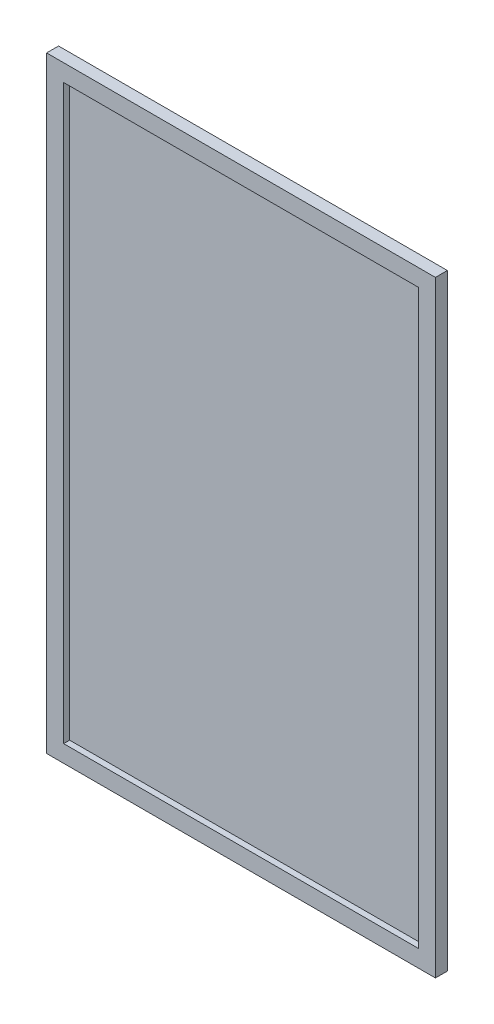
ISO-10303-21;
HEADER;
FILE_DESCRIPTION(('STEP AP214'),'2;1');
FILE_NAME('part.step','',(''),(''),'','','');
FILE_SCHEMA(('AUTOMOTIVE_DESIGN { 1 0 10303 214 1 1 1 1 }'));
ENDSEC;
DATA;
#1=APPLICATION_CONTEXT('core data for automotive mechanical design processes');
#2=APPLICATION_PROTOCOL_DEFINITION('international standard','automotive_design',2000,#1);
#3=PRODUCT_CONTEXT('',#1,'mechanical');
#4=PRODUCT('Part','Part','',(#3));
#5=PRODUCT_RELATED_PRODUCT_CATEGORY('part','',(#4));
#6=PRODUCT_DEFINITION_FORMATION('','',#4);
#7=PRODUCT_DEFINITION_CONTEXT('part definition',#1,'design');
#8=PRODUCT_DEFINITION('design','',#6,#7);
#9=PRODUCT_DEFINITION_SHAPE('','',#8);
#10=(LENGTH_UNIT() NAMED_UNIT(*) SI_UNIT(.MILLI.,.METRE.));
#11=(NAMED_UNIT(*) PLANE_ANGLE_UNIT() SI_UNIT($,.RADIAN.));
#12=(NAMED_UNIT(*) SI_UNIT($,.STERADIAN.) SOLID_ANGLE_UNIT());
#13=UNCERTAINTY_MEASURE_WITH_UNIT(LENGTH_MEASURE(1.E-05),#10,'distance_accuracy_value','');
#14=(GEOMETRIC_REPRESENTATION_CONTEXT(3) GLOBAL_UNCERTAINTY_ASSIGNED_CONTEXT((#13)) GLOBAL_UNIT_ASSIGNED_CONTEXT((#10,
#11,#12)) REPRESENTATION_CONTEXT('',''));
#15=CARTESIAN_POINT('',(0.,0.,0.));
#16=DIRECTION('',(0.,0.,1.));
#17=DIRECTION('',(1.,0.,0.));
#18=AXIS2_PLACEMENT_3D('',#15,#16,#17);
#19=CARTESIAN_POINT('',(0.,0.,71.12));
#20=DIRECTION('',(1.,0.,0.));
#21=DIRECTION('',(0.,0.,-1.));
#22=AXIS2_PLACEMENT_3D('',#19,#20,#21);
#23=PLANE('',#22);
#24=DIRECTION('',(0.,-1.,0.));
#25=VECTOR('',#24,1.);
#26=CARTESIAN_POINT('',(0.,0.,0.));
#27=LINE('',#26,#25);
#28=CARTESIAN_POINT('',(0.,3606.8,0.));
#29=VERTEX_POINT('',#28);
#30=CARTESIAN_POINT('',(0.,0.,0.));
#31=VERTEX_POINT('',#30);
#32=EDGE_CURVE('E160',#29,#31,#27,.T.);
#33=ORIENTED_EDGE('',*,*,#32,.T.);
#34=DIRECTION('',(0.,0.,-1.));
#35=VECTOR('',#34,1.);
#36=CARTESIAN_POINT('',(0.,0.,71.12));
#37=LINE('',#36,#35);
#38=CARTESIAN_POINT('',(0.,0.,71.12));
#39=VERTEX_POINT('',#38);
#40=EDGE_CURVE('E11',#39,#31,#37,.T.);
#41=ORIENTED_EDGE('',*,*,#40,.F.);
#42=DIRECTION('',(0.,-1.,0.));
#43=VECTOR('',#42,1.);
#44=CARTESIAN_POINT('',(0.,0.,71.12));
#45=LINE('',#44,#43);
#46=CARTESIAN_POINT('',(0.,3606.8,71.12));
#47=VERTEX_POINT('',#46);
#48=EDGE_CURVE('E166',#47,#39,#45,.T.);
#49=ORIENTED_EDGE('',*,*,#48,.F.);
#50=DIRECTION('',(0.,0.,-1.));
#51=VECTOR('',#50,1.);
#52=CARTESIAN_POINT('',(0.,3606.8,71.12));
#53=LINE('',#52,#51);
#54=EDGE_CURVE('E176',#47,#29,#53,.T.);
#55=ORIENTED_EDGE('',*,*,#54,.T.);
#56=EDGE_LOOP('',(#33,#41,#49,#55));
#57=FACE_BOUND('',#56,.T.);
#58=ADVANCED_FACE('F41',(#57),#23,.F.);
#59=CARTESIAN_POINT('',(0.,0.,71.12));
#60=DIRECTION('',(0.,1.,0.));
#61=DIRECTION('',(0.,0.,1.));
#62=AXIS2_PLACEMENT_3D('',#59,#60,#61);
#63=PLANE('',#62);
#64=DIRECTION('',(1.,0.,0.));
#65=VECTOR('',#64,1.);
#66=CARTESIAN_POINT('',(0.,0.,0.));
#67=LINE('',#66,#65);
#68=CARTESIAN_POINT('',(2311.4,0.,0.));
#69=VERTEX_POINT('',#68);
#70=EDGE_CURVE('E180',#31,#69,#67,.T.);
#71=ORIENTED_EDGE('',*,*,#70,.T.);
#72=DIRECTION('',(0.,0.,-1.));
#73=VECTOR('',#72,1.);
#74=CARTESIAN_POINT('',(2311.4,0.,71.12));
#75=LINE('',#74,#73);
#76=CARTESIAN_POINT('',(2311.4,0.,71.12));
#77=VERTEX_POINT('',#76);
#78=EDGE_CURVE('E49',#77,#69,#75,.T.);
#79=ORIENTED_EDGE('',*,*,#78,.F.);
#80=DIRECTION('',(1.,0.,0.));
#81=VECTOR('',#80,1.);
#82=CARTESIAN_POINT('',(0.,0.,71.12));
#83=LINE('',#82,#81);
#84=EDGE_CURVE('E93',#39,#77,#83,.T.);
#85=ORIENTED_EDGE('',*,*,#84,.F.);
#86=ORIENTED_EDGE('',*,*,#40,.T.);
#87=EDGE_LOOP('',(#71,#79,#85,#86));
#88=FACE_BOUND('',#87,.T.);
#89=ADVANCED_FACE('F215',(#88),#63,.F.);
#90=CARTESIAN_POINT('',(2311.4,0.,71.12));
#91=DIRECTION('',(-1.,0.,0.));
#92=DIRECTION('',(0.,0.,1.));
#93=AXIS2_PLACEMENT_3D('',#90,#91,#92);
#94=PLANE('',#93);
#95=DIRECTION('',(0.,1.,0.));
#96=VECTOR('',#95,1.);
#97=CARTESIAN_POINT('',(2311.4,0.,0.));
#98=LINE('',#97,#96);
#99=CARTESIAN_POINT('',(2311.4,3606.8,0.));
#100=VERTEX_POINT('',#99);
#101=EDGE_CURVE('E183',#69,#100,#98,.T.);
#102=ORIENTED_EDGE('',*,*,#101,.T.);
#103=DIRECTION('',(0.,0.,-1.));
#104=VECTOR('',#103,1.);
#105=CARTESIAN_POINT('',(2311.4,3606.8,71.12));
#106=LINE('',#105,#104);
#107=CARTESIAN_POINT('',(2311.4,3606.8,71.12));
#108=VERTEX_POINT('',#107);
#109=EDGE_CURVE('E190',#108,#100,#106,.T.);
#110=ORIENTED_EDGE('',*,*,#109,.F.);
#111=DIRECTION('',(0.,1.,0.));
#112=VECTOR('',#111,1.);
#113=CARTESIAN_POINT('',(2311.4,0.,71.12));
#114=LINE('',#113,#112);
#115=EDGE_CURVE('E171',#77,#108,#114,.T.);
#116=ORIENTED_EDGE('',*,*,#115,.F.);
#117=ORIENTED_EDGE('',*,*,#78,.T.);
#118=EDGE_LOOP('',(#102,#110,#116,#117));
#119=FACE_BOUND('',#118,.T.);
#120=ADVANCED_FACE('F197',(#119),#94,.F.);
#121=CARTESIAN_POINT('',(0.,3606.8,71.12));
#122=DIRECTION('',(0.,-1.,0.));
#123=DIRECTION('',(0.,0.,-1.));
#124=AXIS2_PLACEMENT_3D('',#121,#122,#123);
#125=PLANE('',#124);
#126=DIRECTION('',(-1.,0.,0.));
#127=VECTOR('',#126,1.);
#128=CARTESIAN_POINT('',(0.,3606.8,0.));
#129=LINE('',#128,#127);
#130=EDGE_CURVE('E86',#100,#29,#129,.T.);
#131=ORIENTED_EDGE('',*,*,#130,.T.);
#132=ORIENTED_EDGE('',*,*,#54,.F.);
#133=DIRECTION('',(-1.,0.,0.));
#134=VECTOR('',#133,1.);
#135=CARTESIAN_POINT('',(0.,3606.8,71.12));
#136=LINE('',#135,#134);
#137=EDGE_CURVE('E65',#108,#47,#136,.T.);
#138=ORIENTED_EDGE('',*,*,#137,.F.);
#139=ORIENTED_EDGE('',*,*,#109,.T.);
#140=EDGE_LOOP('',(#131,#132,#138,#139));
#141=FACE_BOUND('',#140,.T.);
#142=ADVANCED_FACE('F205',(#141),#125,.F.);
#143=CARTESIAN_POINT('',(0.,0.,71.12));
#144=DIRECTION('',(0.,0.,-1.));
#145=DIRECTION('',(-1.,0.,0.));
#146=AXIS2_PLACEMENT_3D('',#143,#144,#145);
#147=PLANE('',#146);
#148=DIRECTION('',(1.,0.,0.));
#149=VECTOR('',#148,1.);
#150=CARTESIAN_POINT('',(101.6,101.6,71.12));
#151=LINE('',#150,#149);
#152=CARTESIAN_POINT('',(101.6,101.6,71.12));
#153=VERTEX_POINT('',#152);
#154=CARTESIAN_POINT('',(2209.8,101.6,71.12));
#155=VERTEX_POINT('',#154);
#156=EDGE_CURVE('E151',#153,#155,#151,.T.);
#157=ORIENTED_EDGE('',*,*,#156,.F.);
#158=DIRECTION('',(0.,-1.,0.));
#159=VECTOR('',#158,1.);
#160=CARTESIAN_POINT('',(101.6,101.6,71.12));
#161=LINE('',#160,#159);
#162=CARTESIAN_POINT('',(101.6,3505.2,71.12));
#163=VERTEX_POINT('',#162);
#164=EDGE_CURVE('E56',#163,#153,#161,.T.);
#165=ORIENTED_EDGE('',*,*,#164,.F.);
#166=DIRECTION('',(-1.,0.,0.));
#167=VECTOR('',#166,1.);
#168=CARTESIAN_POINT('',(101.6,3505.2,71.12));
#169=LINE('',#168,#167);
#170=CARTESIAN_POINT('',(2209.8,3505.2,71.12));
#171=VERTEX_POINT('',#170);
#172=EDGE_CURVE('E138',#171,#163,#169,.T.);
#173=ORIENTED_EDGE('',*,*,#172,.F.);
#174=DIRECTION('',(0.,1.,0.));
#175=VECTOR('',#174,1.);
#176=CARTESIAN_POINT('',(2209.8,101.6,71.12));
#177=LINE('',#176,#175);
#178=EDGE_CURVE('E142',#155,#171,#177,.T.);
#179=ORIENTED_EDGE('',*,*,#178,.F.);
#180=EDGE_LOOP('',(#157,#165,#173,#179));
#181=FACE_BOUND('',#180,.T.);
#182=ORIENTED_EDGE('',*,*,#48,.T.);
#183=ORIENTED_EDGE('',*,*,#84,.T.);
#184=ORIENTED_EDGE('',*,*,#115,.T.);
#185=ORIENTED_EDGE('',*,*,#137,.T.);
#186=EDGE_LOOP('',(#182,#183,#184,#185));
#187=FACE_BOUND('',#186,.T.);
#188=ADVANCED_FACE('F207',(#181,#187),#147,.F.);
#189=CARTESIAN_POINT('',(0.,0.,0.));
#190=DIRECTION('',(0.,0.,-1.));
#191=DIRECTION('',(-1.,0.,0.));
#192=AXIS2_PLACEMENT_3D('',#189,#190,#191);
#193=PLANE('',#192);
#194=ORIENTED_EDGE('',*,*,#32,.F.);
#195=ORIENTED_EDGE('',*,*,#130,.F.);
#196=ORIENTED_EDGE('',*,*,#101,.F.);
#197=ORIENTED_EDGE('',*,*,#70,.F.);
#198=EDGE_LOOP('',(#194,#195,#196,#197));
#199=FACE_BOUND('',#198,.T.);
#200=ADVANCED_FACE('F201',(#199),#193,.T.);
#201=CARTESIAN_POINT('',(101.6,101.6,35.56));
#202=DIRECTION('',(-1.,0.,0.));
#203=DIRECTION('',(0.,0.,1.));
#204=AXIS2_PLACEMENT_3D('',#201,#202,#203);
#205=PLANE('',#204);
#206=ORIENTED_EDGE('',*,*,#164,.T.);
#207=DIRECTION('',(0.,0.,1.));
#208=VECTOR('',#207,1.);
#209=CARTESIAN_POINT('',(101.6,101.6,35.56));
#210=LINE('',#209,#208);
#211=CARTESIAN_POINT('',(101.6,101.6,35.56));
#212=VERTEX_POINT('',#211);
#213=EDGE_CURVE('E113',#212,#153,#210,.T.);
#214=ORIENTED_EDGE('',*,*,#213,.F.);
#215=DIRECTION('',(0.,-1.,0.));
#216=VECTOR('',#215,1.);
#217=CARTESIAN_POINT('',(101.6,101.6,35.56));
#218=LINE('',#217,#216);
#219=CARTESIAN_POINT('',(101.6,3505.2,35.56));
#220=VERTEX_POINT('',#219);
#221=EDGE_CURVE('E117',#220,#212,#218,.T.);
#222=ORIENTED_EDGE('',*,*,#221,.F.);
#223=DIRECTION('',(0.,0.,1.));
#224=VECTOR('',#223,1.);
#225=CARTESIAN_POINT('',(101.6,3505.2,35.56));
#226=LINE('',#225,#224);
#227=EDGE_CURVE('E157',#220,#163,#226,.T.);
#228=ORIENTED_EDGE('',*,*,#227,.T.);
#229=EDGE_LOOP('',(#206,#214,#222,#228));
#230=FACE_BOUND('',#229,.T.);
#231=ADVANCED_FACE('F115',(#230),#205,.F.);
#232=CARTESIAN_POINT('',(101.6,3505.2,35.56));
#233=DIRECTION('',(0.,1.,0.));
#234=DIRECTION('',(0.,0.,1.));
#235=AXIS2_PLACEMENT_3D('',#232,#233,#234);
#236=PLANE('',#235);
#237=ORIENTED_EDGE('',*,*,#172,.T.);
#238=ORIENTED_EDGE('',*,*,#227,.F.);
#239=DIRECTION('',(-1.,0.,0.));
#240=VECTOR('',#239,1.);
#241=CARTESIAN_POINT('',(101.6,3505.2,35.56));
#242=LINE('',#241,#240);
#243=CARTESIAN_POINT('',(2209.8,3505.2,35.56));
#244=VERTEX_POINT('',#243);
#245=EDGE_CURVE('E124',#244,#220,#242,.T.);
#246=ORIENTED_EDGE('',*,*,#245,.F.);
#247=DIRECTION('',(0.,0.,1.));
#248=VECTOR('',#247,1.);
#249=CARTESIAN_POINT('',(2209.8,3505.2,35.56));
#250=LINE('',#249,#248);
#251=EDGE_CURVE('E161',#244,#171,#250,.T.);
#252=ORIENTED_EDGE('',*,*,#251,.T.);
#253=EDGE_LOOP('',(#237,#238,#246,#252));
#254=FACE_BOUND('',#253,.T.);
#255=ADVANCED_FACE('F261',(#254),#236,.F.);
#256=CARTESIAN_POINT('',(2209.8,101.6,35.56));
#257=DIRECTION('',(1.,0.,0.));
#258=DIRECTION('',(0.,0.,-1.));
#259=AXIS2_PLACEMENT_3D('',#256,#257,#258);
#260=PLANE('',#259);
#261=ORIENTED_EDGE('',*,*,#178,.T.);
#262=ORIENTED_EDGE('',*,*,#251,.F.);
#263=DIRECTION('',(0.,1.,0.));
#264=VECTOR('',#263,1.);
#265=CARTESIAN_POINT('',(2209.8,101.6,35.56));
#266=LINE('',#265,#264);
#267=CARTESIAN_POINT('',(2209.8,101.6,35.56));
#268=VERTEX_POINT('',#267);
#269=EDGE_CURVE('E133',#268,#244,#266,.T.);
#270=ORIENTED_EDGE('',*,*,#269,.F.);
#271=DIRECTION('',(0.,0.,1.));
#272=VECTOR('',#271,1.);
#273=CARTESIAN_POINT('',(2209.8,101.6,35.56));
#274=LINE('',#273,#272);
#275=EDGE_CURVE('E123',#268,#155,#274,.T.);
#276=ORIENTED_EDGE('',*,*,#275,.T.);
#277=EDGE_LOOP('',(#261,#262,#270,#276));
#278=FACE_BOUND('',#277,.T.);
#279=ADVANCED_FACE('F268',(#278),#260,.F.);
#280=CARTESIAN_POINT('',(101.6,101.6,35.56));
#281=DIRECTION('',(0.,-1.,0.));
#282=DIRECTION('',(0.,0.,-1.));
#283=AXIS2_PLACEMENT_3D('',#280,#281,#282);
#284=PLANE('',#283);
#285=ORIENTED_EDGE('',*,*,#156,.T.);
#286=ORIENTED_EDGE('',*,*,#275,.F.);
#287=DIRECTION('',(1.,0.,0.));
#288=VECTOR('',#287,1.);
#289=CARTESIAN_POINT('',(101.6,101.6,35.56));
#290=LINE('',#289,#288);
#291=EDGE_CURVE('E127',#212,#268,#290,.T.);
#292=ORIENTED_EDGE('',*,*,#291,.F.);
#293=ORIENTED_EDGE('',*,*,#213,.T.);
#294=EDGE_LOOP('',(#285,#286,#292,#293));
#295=FACE_BOUND('',#294,.T.);
#296=ADVANCED_FACE('F128',(#295),#284,.F.);
#297=CARTESIAN_POINT('',(0.,0.,35.56));
#298=DIRECTION('',(0.,0.,-1.));
#299=DIRECTION('',(-1.,0.,0.));
#300=AXIS2_PLACEMENT_3D('',#297,#298,#299);
#301=PLANE('',#300);
#302=ORIENTED_EDGE('',*,*,#221,.T.);
#303=ORIENTED_EDGE('',*,*,#291,.T.);
#304=ORIENTED_EDGE('',*,*,#269,.T.);
#305=ORIENTED_EDGE('',*,*,#245,.T.);
#306=EDGE_LOOP('',(#302,#303,#304,#305));
#307=FACE_BOUND('',#306,.T.);
#308=ADVANCED_FACE('F135',(#307),#301,.F.);
#309=CLOSED_SHELL('',(#58,#89,#120,#142,#188,#200,#231,#255,#279,#296,#308));
#310=MANIFOLD_SOLID_BREP('B2',#309);
#311=ADVANCED_BREP_SHAPE_REPRESENTATION('',(#18,#310),#14);
#312=SHAPE_DEFINITION_REPRESENTATION(#9,#311);
ENDSEC;
END-ISO-10303-21;
